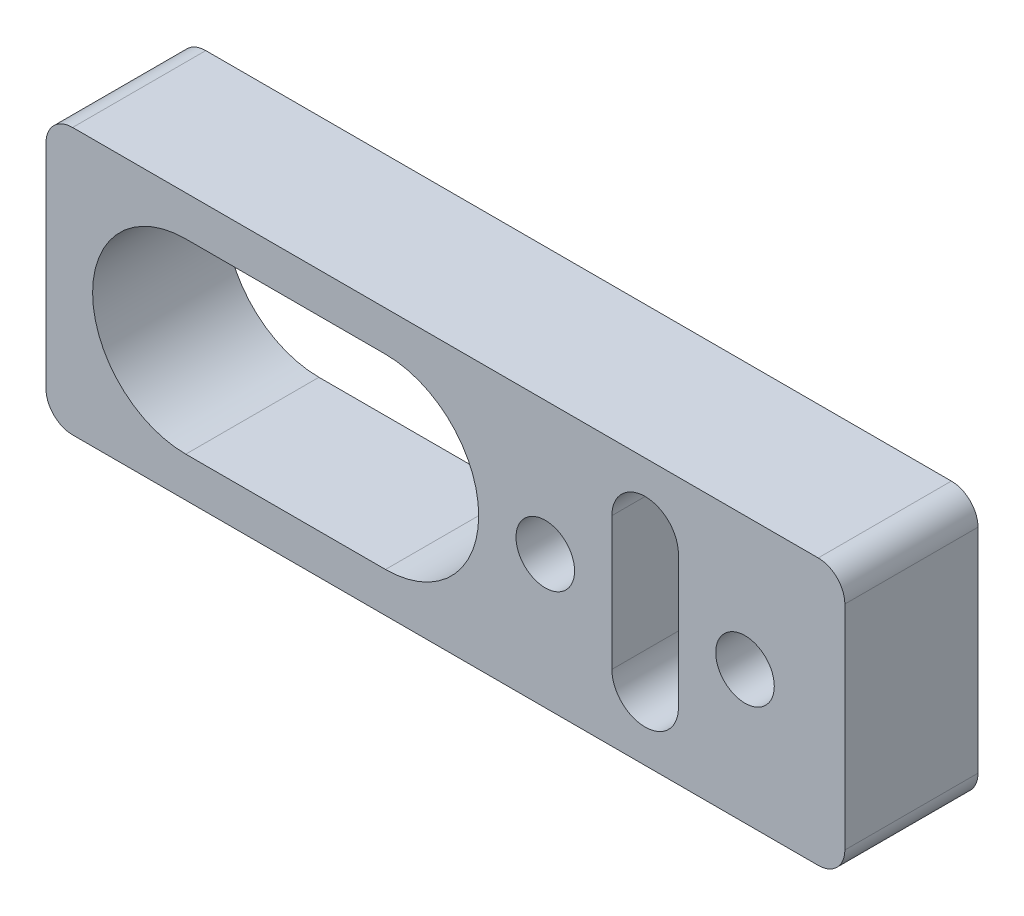
ISO-10303-21;
HEADER;
FILE_DESCRIPTION(('STEP AP214'),'2;1');
FILE_NAME('part.step','',(''),(''),'','','');
FILE_SCHEMA(('AUTOMOTIVE_DESIGN { 1 0 10303 214 1 1 1 1 }'));
ENDSEC;
DATA;
#1=APPLICATION_CONTEXT('core data for automotive mechanical design processes');
#2=APPLICATION_PROTOCOL_DEFINITION('international standard','automotive_design',2000,#1);
#3=PRODUCT_CONTEXT('',#1,'mechanical');
#4=PRODUCT('Part','Part','',(#3));
#5=PRODUCT_RELATED_PRODUCT_CATEGORY('part','',(#4));
#6=PRODUCT_DEFINITION_FORMATION('','',#4);
#7=PRODUCT_DEFINITION_CONTEXT('part definition',#1,'design');
#8=PRODUCT_DEFINITION('design','',#6,#7);
#9=PRODUCT_DEFINITION_SHAPE('','',#8);
#10=(LENGTH_UNIT() NAMED_UNIT(*) SI_UNIT(.MILLI.,.METRE.));
#11=(NAMED_UNIT(*) PLANE_ANGLE_UNIT() SI_UNIT($,.RADIAN.));
#12=(NAMED_UNIT(*) SI_UNIT($,.STERADIAN.) SOLID_ANGLE_UNIT());
#13=UNCERTAINTY_MEASURE_WITH_UNIT(LENGTH_MEASURE(1.E-05),#10,'distance_accuracy_value','');
#14=(GEOMETRIC_REPRESENTATION_CONTEXT(3) GLOBAL_UNCERTAINTY_ASSIGNED_CONTEXT((#13)) GLOBAL_UNIT_ASSIGNED_CONTEXT((#10,
#11,#12)) REPRESENTATION_CONTEXT('',''));
#15=CARTESIAN_POINT('',(0.,0.,0.));
#16=DIRECTION('',(0.,0.,1.));
#17=DIRECTION('',(1.,0.,0.));
#18=AXIS2_PLACEMENT_3D('',#15,#16,#17);
#19=CARTESIAN_POINT('',(30.,-10.,10.));
#20=DIRECTION('',(-1.,0.,0.));
#21=DIRECTION('',(0.,0.,1.));
#22=AXIS2_PLACEMENT_3D('',#19,#20,#21);
#23=PLANE('',#22);
#24=DIRECTION('',(0.,1.,0.));
#25=VECTOR('',#24,1.);
#26=CARTESIAN_POINT('',(30.,-10.,0.));
#27=LINE('',#26,#25);
#28=CARTESIAN_POINT('',(30.,-8.,0.));
#29=VERTEX_POINT('',#28);
#30=CARTESIAN_POINT('',(30.,8.,0.));
#31=VERTEX_POINT('',#30);
#32=EDGE_CURVE('E221',#29,#31,#27,.T.);
#33=ORIENTED_EDGE('',*,*,#32,.T.);
#34=DIRECTION('',(0.,0.,-1.));
#35=VECTOR('',#34,1.);
#36=CARTESIAN_POINT('',(30.,8.,10.));
#37=LINE('',#36,#35);
#38=CARTESIAN_POINT('',(30.,8.,10.));
#39=VERTEX_POINT('',#38);
#40=EDGE_CURVE('E269',#31,#39,#37,.F.);
#41=ORIENTED_EDGE('',*,*,#40,.T.);
#42=DIRECTION('',(0.,1.,0.));
#43=VECTOR('',#42,1.);
#44=CARTESIAN_POINT('',(30.,-10.,10.));
#45=LINE('',#44,#43);
#46=CARTESIAN_POINT('',(30.,-8.,10.));
#47=VERTEX_POINT('',#46);
#48=EDGE_CURVE('E230',#47,#39,#45,.T.);
#49=ORIENTED_EDGE('',*,*,#48,.F.);
#50=DIRECTION('',(0.,0.,-1.));
#51=VECTOR('',#50,1.);
#52=CARTESIAN_POINT('',(30.,-8.,10.));
#53=LINE('',#52,#51);
#54=EDGE_CURVE('E266',#47,#29,#53,.T.);
#55=ORIENTED_EDGE('',*,*,#54,.T.);
#56=EDGE_LOOP('',(#33,#41,#49,#55));
#57=FACE_BOUND('',#56,.T.);
#58=ADVANCED_FACE('F36',(#57),#23,.F.);
#59=CARTESIAN_POINT('',(-30.,10.,10.));
#60=DIRECTION('',(0.,-1.,0.));
#61=DIRECTION('',(0.,0.,-1.));
#62=AXIS2_PLACEMENT_3D('',#59,#60,#61);
#63=PLANE('',#62);
#64=DIRECTION('',(-1.,0.,0.));
#65=VECTOR('',#64,1.);
#66=CARTESIAN_POINT('',(-30.,10.,10.));
#67=LINE('',#66,#65);
#68=CARTESIAN_POINT('',(28.,10.,10.));
#69=VERTEX_POINT('',#68);
#70=CARTESIAN_POINT('',(-28.,10.,10.));
#71=VERTEX_POINT('',#70);
#72=EDGE_CURVE('E233',#69,#71,#67,.T.);
#73=ORIENTED_EDGE('',*,*,#72,.F.);
#74=DIRECTION('',(0.,0.,-1.));
#75=VECTOR('',#74,1.);
#76=CARTESIAN_POINT('',(28.,10.,10.));
#77=LINE('',#76,#75);
#78=CARTESIAN_POINT('',(28.,10.,0.));
#79=VERTEX_POINT('',#78);
#80=EDGE_CURVE('E255',#69,#79,#77,.T.);
#81=ORIENTED_EDGE('',*,*,#80,.T.);
#82=DIRECTION('',(-1.,0.,0.));
#83=VECTOR('',#82,1.);
#84=CARTESIAN_POINT('',(-30.,10.,0.));
#85=LINE('',#84,#83);
#86=CARTESIAN_POINT('',(-28.,10.,0.));
#87=VERTEX_POINT('',#86);
#88=EDGE_CURVE('E246',#79,#87,#85,.T.);
#89=ORIENTED_EDGE('',*,*,#88,.T.);
#90=DIRECTION('',(0.,0.,-1.));
#91=VECTOR('',#90,1.);
#92=CARTESIAN_POINT('',(-28.,10.,10.));
#93=LINE('',#92,#91);
#94=EDGE_CURVE('E243',#87,#71,#93,.F.);
#95=ORIENTED_EDGE('',*,*,#94,.T.);
#96=EDGE_LOOP('',(#73,#81,#89,#95));
#97=FACE_BOUND('',#96,.T.);
#98=ADVANCED_FACE('F319',(#97),#63,.F.);
#99=CARTESIAN_POINT('',(-30.,-10.,10.));
#100=DIRECTION('',(1.,0.,0.));
#101=DIRECTION('',(0.,0.,-1.));
#102=AXIS2_PLACEMENT_3D('',#99,#100,#101);
#103=PLANE('',#102);
#104=DIRECTION('',(0.,-1.,0.));
#105=VECTOR('',#104,1.);
#106=CARTESIAN_POINT('',(-30.,-10.,0.));
#107=LINE('',#106,#105);
#108=CARTESIAN_POINT('',(-30.,8.,0.));
#109=VERTEX_POINT('',#108);
#110=CARTESIAN_POINT('',(-30.,-8.,0.));
#111=VERTEX_POINT('',#110);
#112=EDGE_CURVE('E249',#109,#111,#107,.T.);
#113=ORIENTED_EDGE('',*,*,#112,.T.);
#114=DIRECTION('',(0.,0.,-1.));
#115=VECTOR('',#114,1.);
#116=CARTESIAN_POINT('',(-30.,-8.,10.));
#117=LINE('',#116,#115);
#118=CARTESIAN_POINT('',(-30.,-8.,10.));
#119=VERTEX_POINT('',#118);
#120=EDGE_CURVE('E11',#111,#119,#117,.F.);
#121=ORIENTED_EDGE('',*,*,#120,.T.);
#122=DIRECTION('',(0.,-1.,0.));
#123=VECTOR('',#122,1.);
#124=CARTESIAN_POINT('',(-30.,-10.,10.));
#125=LINE('',#124,#123);
#126=CARTESIAN_POINT('',(-30.,8.,10.));
#127=VERTEX_POINT('',#126);
#128=EDGE_CURVE('E237',#127,#119,#125,.T.);
#129=ORIENTED_EDGE('',*,*,#128,.F.);
#130=DIRECTION('',(0.,0.,-1.));
#131=VECTOR('',#130,1.);
#132=CARTESIAN_POINT('',(-30.,8.,10.));
#133=LINE('',#132,#131);
#134=EDGE_CURVE('E44',#127,#109,#133,.T.);
#135=ORIENTED_EDGE('',*,*,#134,.T.);
#136=EDGE_LOOP('',(#113,#121,#129,#135));
#137=FACE_BOUND('',#136,.T.);
#138=ADVANCED_FACE('F288',(#137),#103,.F.);
#139=CARTESIAN_POINT('',(-30.,-10.,10.));
#140=DIRECTION('',(0.,1.,0.));
#141=DIRECTION('',(0.,0.,1.));
#142=AXIS2_PLACEMENT_3D('',#139,#140,#141);
#143=PLANE('',#142);
#144=DIRECTION('',(1.,0.,0.));
#145=VECTOR('',#144,1.);
#146=CARTESIAN_POINT('',(-30.,-10.,0.));
#147=LINE('',#146,#145);
#148=CARTESIAN_POINT('',(-28.,-10.,0.));
#149=VERTEX_POINT('',#148);
#150=CARTESIAN_POINT('',(28.,-10.,0.));
#151=VERTEX_POINT('',#150);
#152=EDGE_CURVE('E234',#149,#151,#147,.T.);
#153=ORIENTED_EDGE('',*,*,#152,.T.);
#154=DIRECTION('',(0.,0.,-1.));
#155=VECTOR('',#154,1.);
#156=CARTESIAN_POINT('',(28.,-10.,10.));
#157=LINE('',#156,#155);
#158=CARTESIAN_POINT('',(28.,-10.,10.));
#159=VERTEX_POINT('',#158);
#160=EDGE_CURVE('E282',#151,#159,#157,.F.);
#161=ORIENTED_EDGE('',*,*,#160,.T.);
#162=DIRECTION('',(1.,0.,0.));
#163=VECTOR('',#162,1.);
#164=CARTESIAN_POINT('',(-30.,-10.,10.));
#165=LINE('',#164,#163);
#166=CARTESIAN_POINT('',(-28.,-10.,10.));
#167=VERTEX_POINT('',#166);
#168=EDGE_CURVE('E240',#167,#159,#165,.T.);
#169=ORIENTED_EDGE('',*,*,#168,.F.);
#170=DIRECTION('',(0.,0.,-1.));
#171=VECTOR('',#170,1.);
#172=CARTESIAN_POINT('',(-28.,-10.,10.));
#173=LINE('',#172,#171);
#174=EDGE_CURVE('E279',#167,#149,#173,.T.);
#175=ORIENTED_EDGE('',*,*,#174,.T.);
#176=EDGE_LOOP('',(#153,#161,#169,#175));
#177=FACE_BOUND('',#176,.T.);
#178=ADVANCED_FACE('F301',(#177),#143,.F.);
#179=CARTESIAN_POINT('',(0.,0.,10.));
#180=DIRECTION('',(0.,0.,-1.));
#181=DIRECTION('',(-1.,0.,0.));
#182=AXIS2_PLACEMENT_3D('',#179,#180,#181);
#183=PLANE('',#182);
#184=DIRECTION('',(1.,0.,0.));
#185=VECTOR('',#184,1.);
#186=CARTESIAN_POINT('',(-19.5,-7.,10.));
#187=LINE('',#186,#185);
#188=CARTESIAN_POINT('',(-19.5,-7.,10.));
#189=VERTEX_POINT('',#188);
#190=CARTESIAN_POINT('',(-4.5,-7.,10.));
#191=VERTEX_POINT('',#190);
#192=EDGE_CURVE('E178',#189,#191,#187,.T.);
#193=ORIENTED_EDGE('',*,*,#192,.F.);
#194=CARTESIAN_POINT('',(-19.5,0.,10.));
#195=DIRECTION('',(0.,0.,1.));
#196=DIRECTION('',(1.,0.,0.));
#197=AXIS2_PLACEMENT_3D('',#194,#195,#196);
#198=CIRCLE('',#197,7.);
#199=CARTESIAN_POINT('',(-19.5,7.,10.));
#200=VERTEX_POINT('',#199);
#201=EDGE_CURVE('E51',#200,#189,#198,.T.);
#202=ORIENTED_EDGE('',*,*,#201,.F.);
#203=DIRECTION('',(-1.,0.,0.));
#204=VECTOR('',#203,1.);
#205=CARTESIAN_POINT('',(-19.5,7.,10.));
#206=LINE('',#205,#204);
#207=CARTESIAN_POINT('',(-4.5,7.,10.));
#208=VERTEX_POINT('',#207);
#209=EDGE_CURVE('E169',#208,#200,#206,.T.);
#210=ORIENTED_EDGE('',*,*,#209,.F.);
#211=CARTESIAN_POINT('',(-4.5,0.,10.));
#212=DIRECTION('',(0.,0.,1.));
#213=DIRECTION('',(1.,0.,0.));
#214=AXIS2_PLACEMENT_3D('',#211,#212,#213);
#215=CIRCLE('',#214,7.);
#216=EDGE_CURVE('E172',#191,#208,#215,.T.);
#217=ORIENTED_EDGE('',*,*,#216,.F.);
#218=EDGE_LOOP('',(#193,#202,#210,#217));
#219=FACE_BOUND('',#218,.T.);
#220=DIRECTION('',(0.,1.,0.));
#221=VECTOR('',#220,1.);
#222=CARTESIAN_POINT('',(17.5,-5.,10.));
#223=LINE('',#222,#221);
#224=CARTESIAN_POINT('',(17.5,-5.,10.));
#225=VERTEX_POINT('',#224);
#226=CARTESIAN_POINT('',(17.5,5.,10.));
#227=VERTEX_POINT('',#226);
#228=EDGE_CURVE('E204',#225,#227,#223,.T.);
#229=ORIENTED_EDGE('',*,*,#228,.F.);
#230=CARTESIAN_POINT('',(15.,-5.,10.));
#231=DIRECTION('',(0.,0.,1.));
#232=DIRECTION('',(1.,0.,0.));
#233=AXIS2_PLACEMENT_3D('',#230,#231,#232);
#234=CIRCLE('',#233,2.5);
#235=CARTESIAN_POINT('',(12.5,-5.,10.));
#236=VERTEX_POINT('',#235);
#237=EDGE_CURVE('E59',#236,#225,#234,.T.);
#238=ORIENTED_EDGE('',*,*,#237,.F.);
#239=DIRECTION('',(0.,-1.,0.));
#240=VECTOR('',#239,1.);
#241=CARTESIAN_POINT('',(12.5,-5.,10.));
#242=LINE('',#241,#240);
#243=CARTESIAN_POINT('',(12.5,5.,10.));
#244=VERTEX_POINT('',#243);
#245=EDGE_CURVE('E193',#244,#236,#242,.T.);
#246=ORIENTED_EDGE('',*,*,#245,.F.);
#247=CARTESIAN_POINT('',(15.,5.,10.));
#248=DIRECTION('',(0.,0.,1.));
#249=DIRECTION('',(1.,0.,0.));
#250=AXIS2_PLACEMENT_3D('',#247,#248,#249);
#251=CIRCLE('',#250,2.5);
#252=EDGE_CURVE('E207',#227,#244,#251,.T.);
#253=ORIENTED_EDGE('',*,*,#252,.F.);
#254=EDGE_LOOP('',(#229,#238,#246,#253));
#255=FACE_BOUND('',#254,.T.);
#256=CARTESIAN_POINT('',(22.5,0.,10.));
#257=DIRECTION('',(0.,0.,1.));
#258=DIRECTION('',(1.,0.,0.));
#259=AXIS2_PLACEMENT_3D('',#256,#257,#258);
#260=CIRCLE('',#259,2.2);
#261=CARTESIAN_POINT('',(24.7,0.,10.));
#262=VERTEX_POINT('',#261);
#263=EDGE_CURVE('E222',#262,#262,#260,.T.);
#264=ORIENTED_EDGE('',*,*,#263,.F.);
#265=EDGE_LOOP('',(#264));
#266=FACE_BOUND('',#265,.T.);
#267=CARTESIAN_POINT('',(7.5,0.,10.));
#268=DIRECTION('',(0.,0.,1.));
#269=DIRECTION('',(1.,0.,0.));
#270=AXIS2_PLACEMENT_3D('',#267,#268,#269);
#271=CIRCLE('',#270,2.2);
#272=CARTESIAN_POINT('',(9.7,0.,10.));
#273=VERTEX_POINT('',#272);
#274=EDGE_CURVE('E185',#273,#273,#271,.T.);
#275=ORIENTED_EDGE('',*,*,#274,.F.);
#276=EDGE_LOOP('',(#275));
#277=FACE_BOUND('',#276,.T.);
#278=ORIENTED_EDGE('',*,*,#48,.T.);
#279=CARTESIAN_POINT('',(28.,8.,10.));
#280=DIRECTION('',(0.,0.,-1.));
#281=DIRECTION('',(-1.,0.,0.));
#282=AXIS2_PLACEMENT_3D('',#279,#280,#281);
#283=CIRCLE('',#282,2.);
#284=EDGE_CURVE('E277',#39,#69,#283,.F.);
#285=ORIENTED_EDGE('',*,*,#284,.T.);
#286=ORIENTED_EDGE('',*,*,#72,.T.);
#287=CARTESIAN_POINT('',(-28.,8.,10.));
#288=DIRECTION('',(0.,0.,-1.));
#289=DIRECTION('',(-1.,0.,0.));
#290=AXIS2_PLACEMENT_3D('',#287,#288,#289);
#291=CIRCLE('',#290,2.);
#292=EDGE_CURVE('E271',#71,#127,#291,.F.);
#293=ORIENTED_EDGE('',*,*,#292,.T.);
#294=ORIENTED_EDGE('',*,*,#128,.T.);
#295=CARTESIAN_POINT('',(-28.,-8.,10.));
#296=DIRECTION('',(0.,0.,-1.));
#297=DIRECTION('',(-1.,0.,0.));
#298=AXIS2_PLACEMENT_3D('',#295,#296,#297);
#299=CIRCLE('',#298,2.);
#300=EDGE_CURVE('E273',#119,#167,#299,.F.);
#301=ORIENTED_EDGE('',*,*,#300,.T.);
#302=ORIENTED_EDGE('',*,*,#168,.T.);
#303=CARTESIAN_POINT('',(28.,-8.,10.));
#304=DIRECTION('',(0.,0.,-1.));
#305=DIRECTION('',(-1.,0.,0.));
#306=AXIS2_PLACEMENT_3D('',#303,#304,#305);
#307=CIRCLE('',#306,2.);
#308=EDGE_CURVE('E275',#159,#47,#307,.F.);
#309=ORIENTED_EDGE('',*,*,#308,.T.);
#310=EDGE_LOOP('',(#278,#285,#286,#293,#294,#301,#302,#309));
#311=FACE_BOUND('',#310,.T.);
#312=ADVANCED_FACE('F305',(#219,#255,#266,#277,#311),#183,.F.);
#313=CARTESIAN_POINT('',(0.,0.,0.));
#314=DIRECTION('',(0.,0.,-1.));
#315=DIRECTION('',(-1.,0.,0.));
#316=AXIS2_PLACEMENT_3D('',#313,#314,#315);
#317=PLANE('',#316);
#318=CARTESIAN_POINT('',(-19.5,0.,0.));
#319=DIRECTION('',(0.,0.,1.));
#320=DIRECTION('',(1.,0.,0.));
#321=AXIS2_PLACEMENT_3D('',#318,#319,#320);
#322=CIRCLE('',#321,7.);
#323=CARTESIAN_POINT('',(-19.5,7.,0.));
#324=VERTEX_POINT('',#323);
#325=CARTESIAN_POINT('',(-19.5,-7.,0.));
#326=VERTEX_POINT('',#325);
#327=EDGE_CURVE('E150',#324,#326,#322,.T.);
#328=ORIENTED_EDGE('',*,*,#327,.T.);
#329=DIRECTION('',(1.,0.,0.));
#330=VECTOR('',#329,1.);
#331=CARTESIAN_POINT('',(-19.5,-7.,0.));
#332=LINE('',#331,#330);
#333=CARTESIAN_POINT('',(-4.5,-7.,0.));
#334=VERTEX_POINT('',#333);
#335=EDGE_CURVE('E160',#326,#334,#332,.T.);
#336=ORIENTED_EDGE('',*,*,#335,.T.);
#337=CARTESIAN_POINT('',(-4.5,0.,0.));
#338=DIRECTION('',(0.,0.,1.));
#339=DIRECTION('',(1.,0.,0.));
#340=AXIS2_PLACEMENT_3D('',#337,#338,#339);
#341=CIRCLE('',#340,7.);
#342=CARTESIAN_POINT('',(-4.5,7.,0.));
#343=VERTEX_POINT('',#342);
#344=EDGE_CURVE('E164',#334,#343,#341,.T.);
#345=ORIENTED_EDGE('',*,*,#344,.T.);
#346=DIRECTION('',(-1.,0.,0.));
#347=VECTOR('',#346,1.);
#348=CARTESIAN_POINT('',(-19.5,7.,0.));
#349=LINE('',#348,#347);
#350=EDGE_CURVE('E156',#343,#324,#349,.T.);
#351=ORIENTED_EDGE('',*,*,#350,.T.);
#352=EDGE_LOOP('',(#328,#336,#345,#351));
#353=FACE_BOUND('',#352,.T.);
#354=CARTESIAN_POINT('',(15.,-5.,0.));
#355=DIRECTION('',(0.,0.,1.));
#356=DIRECTION('',(1.,0.,0.));
#357=AXIS2_PLACEMENT_3D('',#354,#355,#356);
#358=CIRCLE('',#357,2.5);
#359=CARTESIAN_POINT('',(12.5,-5.,0.));
#360=VERTEX_POINT('',#359);
#361=CARTESIAN_POINT('',(17.5,-5.,0.));
#362=VERTEX_POINT('',#361);
#363=EDGE_CURVE('E189',#360,#362,#358,.T.);
#364=ORIENTED_EDGE('',*,*,#363,.T.);
#365=DIRECTION('',(0.,1.,0.));
#366=VECTOR('',#365,1.);
#367=CARTESIAN_POINT('',(17.5,-5.,0.));
#368=LINE('',#367,#366);
#369=CARTESIAN_POINT('',(17.5,5.,0.));
#370=VERTEX_POINT('',#369);
#371=EDGE_CURVE('E192',#362,#370,#368,.T.);
#372=ORIENTED_EDGE('',*,*,#371,.T.);
#373=CARTESIAN_POINT('',(15.,5.,0.));
#374=DIRECTION('',(0.,0.,1.));
#375=DIRECTION('',(1.,0.,0.));
#376=AXIS2_PLACEMENT_3D('',#373,#374,#375);
#377=CIRCLE('',#376,2.5);
#378=CARTESIAN_POINT('',(12.5,5.,0.));
#379=VERTEX_POINT('',#378);
#380=EDGE_CURVE('E196',#370,#379,#377,.T.);
#381=ORIENTED_EDGE('',*,*,#380,.T.);
#382=DIRECTION('',(0.,-1.,0.));
#383=VECTOR('',#382,1.);
#384=CARTESIAN_POINT('',(12.5,-5.,0.));
#385=LINE('',#384,#383);
#386=EDGE_CURVE('E199',#379,#360,#385,.T.);
#387=ORIENTED_EDGE('',*,*,#386,.T.);
#388=EDGE_LOOP('',(#364,#372,#381,#387));
#389=FACE_BOUND('',#388,.T.);
#390=CARTESIAN_POINT('',(22.5,0.,0.));
#391=DIRECTION('',(0.,0.,1.));
#392=DIRECTION('',(1.,0.,0.));
#393=AXIS2_PLACEMENT_3D('',#390,#391,#392);
#394=CIRCLE('',#393,2.2);
#395=CARTESIAN_POINT('',(24.7,0.,0.));
#396=VERTEX_POINT('',#395);
#397=EDGE_CURVE('E218',#396,#396,#394,.T.);
#398=ORIENTED_EDGE('',*,*,#397,.T.);
#399=EDGE_LOOP('',(#398));
#400=FACE_BOUND('',#399,.T.);
#401=CARTESIAN_POINT('',(7.5,0.,0.));
#402=DIRECTION('',(0.,0.,1.));
#403=DIRECTION('',(1.,0.,0.));
#404=AXIS2_PLACEMENT_3D('',#401,#402,#403);
#405=CIRCLE('',#404,2.2);
#406=CARTESIAN_POINT('',(9.7,0.,0.));
#407=VERTEX_POINT('',#406);
#408=EDGE_CURVE('E225',#407,#407,#405,.T.);
#409=ORIENTED_EDGE('',*,*,#408,.T.);
#410=EDGE_LOOP('',(#409));
#411=FACE_BOUND('',#410,.T.);
#412=ORIENTED_EDGE('',*,*,#88,.F.);
#413=CARTESIAN_POINT('',(28.,8.,0.));
#414=DIRECTION('',(0.,0.,-1.));
#415=DIRECTION('',(-1.,0.,0.));
#416=AXIS2_PLACEMENT_3D('',#413,#414,#415);
#417=CIRCLE('',#416,2.);
#418=EDGE_CURVE('E264',#79,#31,#417,.T.);
#419=ORIENTED_EDGE('',*,*,#418,.T.);
#420=ORIENTED_EDGE('',*,*,#32,.F.);
#421=CARTESIAN_POINT('',(28.,-8.,0.));
#422=DIRECTION('',(0.,0.,-1.));
#423=DIRECTION('',(-1.,0.,0.));
#424=AXIS2_PLACEMENT_3D('',#421,#422,#423);
#425=CIRCLE('',#424,2.);
#426=EDGE_CURVE('E262',#29,#151,#425,.T.);
#427=ORIENTED_EDGE('',*,*,#426,.T.);
#428=ORIENTED_EDGE('',*,*,#152,.F.);
#429=CARTESIAN_POINT('',(-28.,-8.,0.));
#430=DIRECTION('',(0.,0.,-1.));
#431=DIRECTION('',(-1.,0.,0.));
#432=AXIS2_PLACEMENT_3D('',#429,#430,#431);
#433=CIRCLE('',#432,2.);
#434=EDGE_CURVE('E260',#149,#111,#433,.T.);
#435=ORIENTED_EDGE('',*,*,#434,.T.);
#436=ORIENTED_EDGE('',*,*,#112,.F.);
#437=CARTESIAN_POINT('',(-28.,8.,0.));
#438=DIRECTION('',(0.,0.,-1.));
#439=DIRECTION('',(-1.,0.,0.));
#440=AXIS2_PLACEMENT_3D('',#437,#438,#439);
#441=CIRCLE('',#440,2.);
#442=EDGE_CURVE('E258',#109,#87,#441,.T.);
#443=ORIENTED_EDGE('',*,*,#442,.T.);
#444=EDGE_LOOP('',(#412,#419,#420,#427,#428,#435,#436,#443));
#445=FACE_BOUND('',#444,.T.);
#446=ADVANCED_FACE('F166',(#353,#389,#400,#411,#445),#317,.T.);
#447=CARTESIAN_POINT('',(28.,8.,10.));
#448=DIRECTION('',(0.,0.,-1.));
#449=DIRECTION('',(-1.,0.,0.));
#450=AXIS2_PLACEMENT_3D('',#447,#448,#449);
#451=CYLINDRICAL_SURFACE('',#450,2.);
#452=ORIENTED_EDGE('',*,*,#284,.F.);
#453=ORIENTED_EDGE('',*,*,#40,.F.);
#454=ORIENTED_EDGE('',*,*,#418,.F.);
#455=ORIENTED_EDGE('',*,*,#80,.F.);
#456=EDGE_LOOP('',(#452,#453,#454,#455));
#457=FACE_BOUND('',#456,.T.);
#458=ADVANCED_FACE('F316',(#457),#451,.T.);
#459=CARTESIAN_POINT('',(28.,-8.,10.));
#460=DIRECTION('',(0.,0.,-1.));
#461=DIRECTION('',(-1.,0.,0.));
#462=AXIS2_PLACEMENT_3D('',#459,#460,#461);
#463=CYLINDRICAL_SURFACE('',#462,2.);
#464=ORIENTED_EDGE('',*,*,#308,.F.);
#465=ORIENTED_EDGE('',*,*,#160,.F.);
#466=ORIENTED_EDGE('',*,*,#426,.F.);
#467=ORIENTED_EDGE('',*,*,#54,.F.);
#468=EDGE_LOOP('',(#464,#465,#466,#467));
#469=FACE_BOUND('',#468,.T.);
#470=ADVANCED_FACE('F309',(#469),#463,.T.);
#471=CARTESIAN_POINT('',(-28.,-8.,10.));
#472=DIRECTION('',(0.,0.,-1.));
#473=DIRECTION('',(-1.,0.,0.));
#474=AXIS2_PLACEMENT_3D('',#471,#472,#473);
#475=CYLINDRICAL_SURFACE('',#474,2.);
#476=ORIENTED_EDGE('',*,*,#300,.F.);
#477=ORIENTED_EDGE('',*,*,#120,.F.);
#478=ORIENTED_EDGE('',*,*,#434,.F.);
#479=ORIENTED_EDGE('',*,*,#174,.F.);
#480=EDGE_LOOP('',(#476,#477,#478,#479));
#481=FACE_BOUND('',#480,.T.);
#482=ADVANCED_FACE('F298',(#481),#475,.T.);
#483=CARTESIAN_POINT('',(-28.,8.,10.));
#484=DIRECTION('',(0.,0.,-1.));
#485=DIRECTION('',(-1.,0.,0.));
#486=AXIS2_PLACEMENT_3D('',#483,#484,#485);
#487=CYLINDRICAL_SURFACE('',#486,2.);
#488=ORIENTED_EDGE('',*,*,#292,.F.);
#489=ORIENTED_EDGE('',*,*,#94,.F.);
#490=ORIENTED_EDGE('',*,*,#442,.F.);
#491=ORIENTED_EDGE('',*,*,#134,.F.);
#492=EDGE_LOOP('',(#488,#489,#490,#491));
#493=FACE_BOUND('',#492,.T.);
#494=ADVANCED_FACE('F38',(#493),#487,.T.);
#495=CARTESIAN_POINT('',(7.5,0.,0.));
#496=DIRECTION('',(0.,0.,1.));
#497=DIRECTION('',(1.,0.,0.));
#498=AXIS2_PLACEMENT_3D('',#495,#496,#497);
#499=CYLINDRICAL_SURFACE('',#498,2.2);
#500=ORIENTED_EDGE('',*,*,#408,.F.);
#501=EDGE_LOOP('',(#500));
#502=FACE_BOUND('',#501,.T.);
#503=ORIENTED_EDGE('',*,*,#274,.T.);
#504=EDGE_LOOP('',(#503));
#505=FACE_BOUND('',#504,.T.);
#506=ADVANCED_FACE('F322',(#502,#505),#499,.F.);
#507=CARTESIAN_POINT('',(22.5,0.,0.));
#508=DIRECTION('',(0.,0.,1.));
#509=DIRECTION('',(1.,0.,0.));
#510=AXIS2_PLACEMENT_3D('',#507,#508,#509);
#511=CYLINDRICAL_SURFACE('',#510,2.2);
#512=ORIENTED_EDGE('',*,*,#397,.F.);
#513=EDGE_LOOP('',(#512));
#514=FACE_BOUND('',#513,.T.);
#515=ORIENTED_EDGE('',*,*,#263,.T.);
#516=EDGE_LOOP('',(#515));
#517=FACE_BOUND('',#516,.T.);
#518=ADVANCED_FACE('F327',(#514,#517),#511,.F.);
#519=CARTESIAN_POINT('',(15.,-5.,0.));
#520=DIRECTION('',(0.,0.,1.));
#521=DIRECTION('',(1.,0.,0.));
#522=AXIS2_PLACEMENT_3D('',#519,#520,#521);
#523=CYLINDRICAL_SURFACE('',#522,2.5);
#524=ORIENTED_EDGE('',*,*,#237,.T.);
#525=DIRECTION('',(0.,0.,1.));
#526=VECTOR('',#525,1.);
#527=CARTESIAN_POINT('',(17.5,-5.,0.));
#528=LINE('',#527,#526);
#529=EDGE_CURVE('E202',#362,#225,#528,.T.);
#530=ORIENTED_EDGE('',*,*,#529,.F.);
#531=ORIENTED_EDGE('',*,*,#363,.F.);
#532=DIRECTION('',(0.,0.,1.));
#533=VECTOR('',#532,1.);
#534=CARTESIAN_POINT('',(12.5,-5.,0.));
#535=LINE('',#534,#533);
#536=EDGE_CURVE('E179',#360,#236,#535,.T.);
#537=ORIENTED_EDGE('',*,*,#536,.T.);
#538=EDGE_LOOP('',(#524,#530,#531,#537));
#539=FACE_BOUND('',#538,.T.);
#540=ADVANCED_FACE('F369',(#539),#523,.F.);
#541=CARTESIAN_POINT('',(12.5,-5.,0.));
#542=DIRECTION('',(-1.,0.,0.));
#543=DIRECTION('',(0.,0.,1.));
#544=AXIS2_PLACEMENT_3D('',#541,#542,#543);
#545=PLANE('',#544);
#546=ORIENTED_EDGE('',*,*,#245,.T.);
#547=ORIENTED_EDGE('',*,*,#536,.F.);
#548=ORIENTED_EDGE('',*,*,#386,.F.);
#549=DIRECTION('',(0.,0.,1.));
#550=VECTOR('',#549,1.);
#551=CARTESIAN_POINT('',(12.5,5.,0.));
#552=LINE('',#551,#550);
#553=EDGE_CURVE('E213',#379,#244,#552,.T.);
#554=ORIENTED_EDGE('',*,*,#553,.T.);
#555=EDGE_LOOP('',(#546,#547,#548,#554));
#556=FACE_BOUND('',#555,.T.);
#557=ADVANCED_FACE('F398',(#556),#545,.F.);
#558=CARTESIAN_POINT('',(15.,5.,0.));
#559=DIRECTION('',(0.,0.,1.));
#560=DIRECTION('',(1.,0.,0.));
#561=AXIS2_PLACEMENT_3D('',#558,#559,#560);
#562=CYLINDRICAL_SURFACE('',#561,2.5);
#563=ORIENTED_EDGE('',*,*,#252,.T.);
#564=ORIENTED_EDGE('',*,*,#553,.F.);
#565=ORIENTED_EDGE('',*,*,#380,.F.);
#566=DIRECTION('',(0.,0.,1.));
#567=VECTOR('',#566,1.);
#568=CARTESIAN_POINT('',(17.5,5.,0.));
#569=LINE('',#568,#567);
#570=EDGE_CURVE('E215',#370,#227,#569,.T.);
#571=ORIENTED_EDGE('',*,*,#570,.T.);
#572=EDGE_LOOP('',(#563,#564,#565,#571));
#573=FACE_BOUND('',#572,.T.);
#574=ADVANCED_FACE('F407',(#573),#562,.F.);
#575=CARTESIAN_POINT('',(17.5,-5.,0.));
#576=DIRECTION('',(1.,0.,0.));
#577=DIRECTION('',(0.,0.,-1.));
#578=AXIS2_PLACEMENT_3D('',#575,#576,#577);
#579=PLANE('',#578);
#580=ORIENTED_EDGE('',*,*,#228,.T.);
#581=ORIENTED_EDGE('',*,*,#570,.F.);
#582=ORIENTED_EDGE('',*,*,#371,.F.);
#583=ORIENTED_EDGE('',*,*,#529,.T.);
#584=EDGE_LOOP('',(#580,#581,#582,#583));
#585=FACE_BOUND('',#584,.T.);
#586=ADVANCED_FACE('F417',(#585),#579,.F.);
#587=CARTESIAN_POINT('',(-19.5,0.,0.));
#588=DIRECTION('',(0.,0.,1.));
#589=DIRECTION('',(1.,0.,0.));
#590=AXIS2_PLACEMENT_3D('',#587,#588,#589);
#591=CYLINDRICAL_SURFACE('',#590,7.);
#592=ORIENTED_EDGE('',*,*,#201,.T.);
#593=DIRECTION('',(0.,0.,1.));
#594=VECTOR('',#593,1.);
#595=CARTESIAN_POINT('',(-19.5,-7.,0.));
#596=LINE('',#595,#594);
#597=EDGE_CURVE('E146',#326,#189,#596,.T.);
#598=ORIENTED_EDGE('',*,*,#597,.F.);
#599=ORIENTED_EDGE('',*,*,#327,.F.);
#600=DIRECTION('',(0.,0.,1.));
#601=VECTOR('',#600,1.);
#602=CARTESIAN_POINT('',(-19.5,7.,0.));
#603=LINE('',#602,#601);
#604=EDGE_CURVE('E183',#324,#200,#603,.T.);
#605=ORIENTED_EDGE('',*,*,#604,.T.);
#606=EDGE_LOOP('',(#592,#598,#599,#605));
#607=FACE_BOUND('',#606,.T.);
#608=ADVANCED_FACE('F148',(#607),#591,.F.);
#609=CARTESIAN_POINT('',(-19.5,7.,0.));
#610=DIRECTION('',(0.,1.,0.));
#611=DIRECTION('',(-1.,0.,0.));
#612=AXIS2_PLACEMENT_3D('',#609,#610,#611);
#613=PLANE('',#612);
#614=ORIENTED_EDGE('',*,*,#209,.T.);
#615=ORIENTED_EDGE('',*,*,#604,.F.);
#616=ORIENTED_EDGE('',*,*,#350,.F.);
#617=DIRECTION('',(0.,0.,1.));
#618=VECTOR('',#617,1.);
#619=CARTESIAN_POINT('',(-4.5,7.,0.));
#620=LINE('',#619,#618);
#621=EDGE_CURVE('E186',#343,#208,#620,.T.);
#622=ORIENTED_EDGE('',*,*,#621,.T.);
#623=EDGE_LOOP('',(#614,#615,#616,#622));
#624=FACE_BOUND('',#623,.T.);
#625=ADVANCED_FACE('F436',(#624),#613,.F.);
#626=CARTESIAN_POINT('',(-4.5,0.,0.));
#627=DIRECTION('',(0.,0.,1.));
#628=DIRECTION('',(1.,0.,0.));
#629=AXIS2_PLACEMENT_3D('',#626,#627,#628);
#630=CYLINDRICAL_SURFACE('',#629,7.);
#631=ORIENTED_EDGE('',*,*,#216,.T.);
#632=ORIENTED_EDGE('',*,*,#621,.F.);
#633=ORIENTED_EDGE('',*,*,#344,.F.);
#634=DIRECTION('',(0.,0.,1.));
#635=VECTOR('',#634,1.);
#636=CARTESIAN_POINT('',(-4.5,-7.,0.));
#637=LINE('',#636,#635);
#638=EDGE_CURVE('E155',#334,#191,#637,.T.);
#639=ORIENTED_EDGE('',*,*,#638,.T.);
#640=EDGE_LOOP('',(#631,#632,#633,#639));
#641=FACE_BOUND('',#640,.T.);
#642=ADVANCED_FACE('F445',(#641),#630,.F.);
#643=CARTESIAN_POINT('',(-19.5,-7.,0.));
#644=DIRECTION('',(0.,-1.,0.));
#645=DIRECTION('',(1.,0.,0.));
#646=AXIS2_PLACEMENT_3D('',#643,#644,#645);
#647=PLANE('',#646);
#648=ORIENTED_EDGE('',*,*,#192,.T.);
#649=ORIENTED_EDGE('',*,*,#638,.F.);
#650=ORIENTED_EDGE('',*,*,#335,.F.);
#651=ORIENTED_EDGE('',*,*,#597,.T.);
#652=EDGE_LOOP('',(#648,#649,#650,#651));
#653=FACE_BOUND('',#652,.T.);
#654=ADVANCED_FACE('F161',(#653),#647,.F.);
#655=CLOSED_SHELL('',(#58,#98,#138,#178,#312,#446,#458,#470,#482,#494,#506,#518,#540,#557,#574,
#586,#608,#625,#642,#654));
#656=MANIFOLD_SOLID_BREP('B2',#655);
#657=ADVANCED_BREP_SHAPE_REPRESENTATION('',(#18,#656),#14);
#658=SHAPE_DEFINITION_REPRESENTATION(#9,#657);
ENDSEC;
END-ISO-10303-21;
